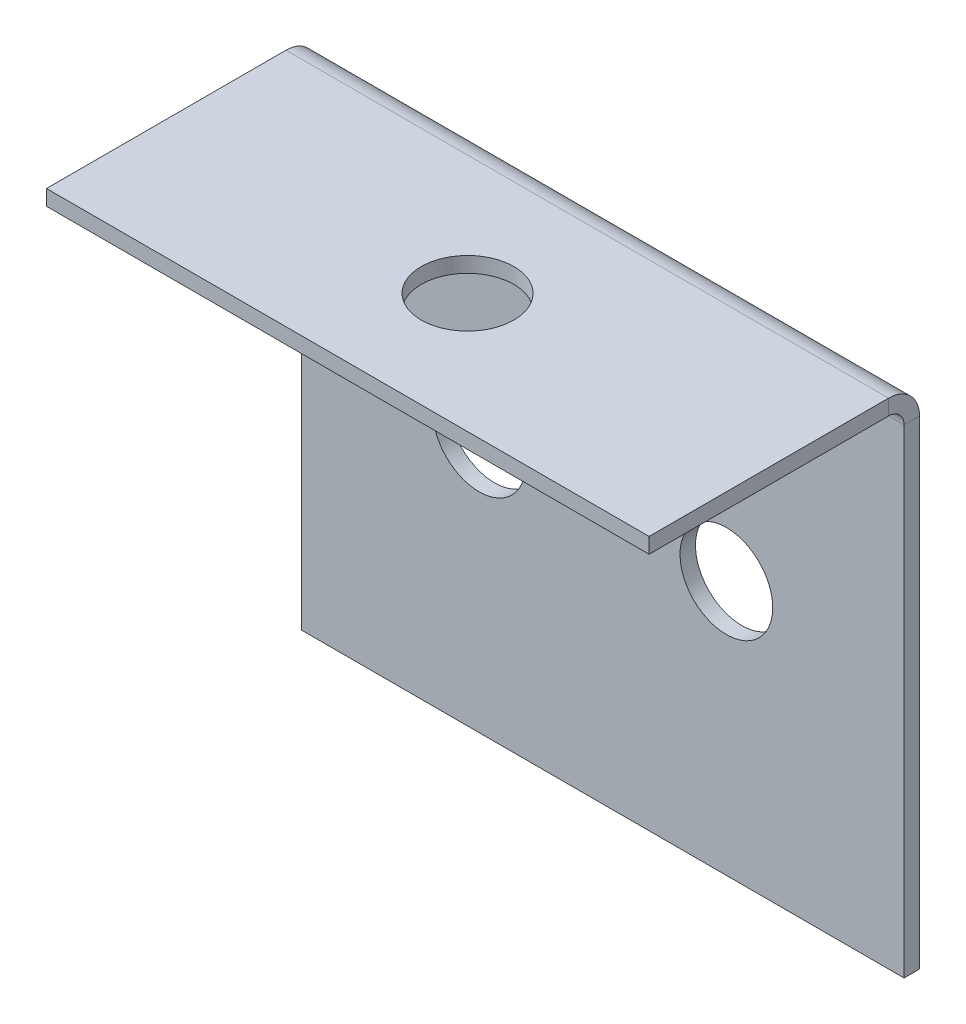
ISO-10303-21;
HEADER;
FILE_DESCRIPTION(('STEP AP214'),'2;1');
FILE_NAME('part.step','',(''),(''),'','','');
FILE_SCHEMA(('AUTOMOTIVE_DESIGN { 1 0 10303 214 1 1 1 1 }'));
ENDSEC;
DATA;
#1=APPLICATION_CONTEXT('core data for automotive mechanical design processes');
#2=APPLICATION_PROTOCOL_DEFINITION('international standard','automotive_design',2000,#1);
#3=PRODUCT_CONTEXT('',#1,'mechanical');
#4=PRODUCT('Part','Part','',(#3));
#5=PRODUCT_RELATED_PRODUCT_CATEGORY('part','',(#4));
#6=PRODUCT_DEFINITION_FORMATION('','',#4);
#7=PRODUCT_DEFINITION_CONTEXT('part definition',#1,'design');
#8=PRODUCT_DEFINITION('design','',#6,#7);
#9=PRODUCT_DEFINITION_SHAPE('','',#8);
#10=(LENGTH_UNIT() NAMED_UNIT(*) SI_UNIT(.MILLI.,.METRE.));
#11=(NAMED_UNIT(*) PLANE_ANGLE_UNIT() SI_UNIT($,.RADIAN.));
#12=(NAMED_UNIT(*) SI_UNIT($,.STERADIAN.) SOLID_ANGLE_UNIT());
#13=UNCERTAINTY_MEASURE_WITH_UNIT(LENGTH_MEASURE(1.E-05),#10,'distance_accuracy_value','');
#14=(GEOMETRIC_REPRESENTATION_CONTEXT(3) GLOBAL_UNCERTAINTY_ASSIGNED_CONTEXT((#13)) GLOBAL_UNIT_ASSIGNED_CONTEXT((#10,
#11,#12)) REPRESENTATION_CONTEXT('',''));
#15=CARTESIAN_POINT('',(0.,0.,0.));
#16=DIRECTION('',(0.,0.,1.));
#17=DIRECTION('',(1.,0.,0.));
#18=AXIS2_PLACEMENT_3D('',#15,#16,#17);
#19=CARTESIAN_POINT('',(19.5,24.9508798646362,0.));
#20=DIRECTION('',(0.,0.,-1.));
#21=DIRECTION('',(0.,1.,0.));
#22=AXIS2_PLACEMENT_3D('',#19,#20,#21);
#23=PLANE('',#22);
#24=DIRECTION('',(0.,-1.,0.));
#25=VECTOR('',#24,1.);
#26=CARTESIAN_POINT('',(0.,24.9508798646362,0.));
#27=LINE('',#26,#25);
#28=CARTESIAN_POINT('',(0.,24.4508798646362,0.));
#29=VERTEX_POINT('',#28);
#30=CARTESIAN_POINT('',(0.,8.95087986463622,0.));
#31=VERTEX_POINT('',#30);
#32=EDGE_CURVE('E150',#29,#31,#27,.T.);
#33=ORIENTED_EDGE('',*,*,#32,.T.);
#34=DIRECTION('',(-1.,0.,0.));
#35=VECTOR('',#34,1.);
#36=CARTESIAN_POINT('',(19.5,8.95087986463622,0.));
#37=LINE('',#36,#35);
#38=CARTESIAN_POINT('',(19.5,8.95087986463622,0.));
#39=VERTEX_POINT('',#38);
#40=EDGE_CURVE('E181',#39,#31,#37,.T.);
#41=ORIENTED_EDGE('',*,*,#40,.F.);
#42=DIRECTION('',(0.,-1.,0.));
#43=VECTOR('',#42,1.);
#44=CARTESIAN_POINT('',(19.5,24.9508798646362,0.));
#45=LINE('',#44,#43);
#46=CARTESIAN_POINT('',(19.5,24.4508798646362,0.));
#47=VERTEX_POINT('',#46);
#48=EDGE_CURVE('E104',#47,#39,#45,.T.);
#49=ORIENTED_EDGE('',*,*,#48,.F.);
#50=DIRECTION('',(-1.,0.,0.));
#51=VECTOR('',#50,1.);
#52=CARTESIAN_POINT('',(19.5,24.4508798646362,0.));
#53=LINE('',#52,#51);
#54=EDGE_CURVE('E149',#47,#29,#53,.T.);
#55=ORIENTED_EDGE('',*,*,#54,.T.);
#56=EDGE_LOOP('',(#33,#41,#49,#55));
#57=FACE_BOUND('',#56,.T.);
#58=CARTESIAN_POINT('',(13.75,17.2008798646362,0.));
#59=DIRECTION('',(0.,0.,-1.));
#60=DIRECTION('',(0.,1.,0.));
#61=AXIS2_PLACEMENT_3D('',#58,#59,#60);
#62=CIRCLE('',#61,1.5);
#63=CARTESIAN_POINT('',(13.75,18.7008798646362,0.));
#64=VERTEX_POINT('',#63);
#65=EDGE_CURVE('E154',#64,#64,#62,.T.);
#66=ORIENTED_EDGE('',*,*,#65,.T.);
#67=EDGE_LOOP('',(#66));
#68=FACE_BOUND('',#67,.T.);
#69=CARTESIAN_POINT('',(5.75,17.2008798646362,0.));
#70=DIRECTION('',(0.,0.,-1.));
#71=DIRECTION('',(0.,1.,0.));
#72=AXIS2_PLACEMENT_3D('',#69,#70,#71);
#73=CIRCLE('',#72,1.5);
#74=CARTESIAN_POINT('',(5.75,18.7008798646362,0.));
#75=VERTEX_POINT('',#74);
#76=EDGE_CURVE('E215',#75,#75,#73,.F.);
#77=ORIENTED_EDGE('',*,*,#76,.F.);
#78=EDGE_LOOP('',(#77));
#79=FACE_BOUND('',#78,.T.);
#80=ADVANCED_FACE('F46',(#57,#68,#79),#23,.F.);
#81=CARTESIAN_POINT('',(19.5,24.9508798646362,-0.5));
#82=DIRECTION('',(0.,0.,-1.));
#83=DIRECTION('',(0.,1.,0.));
#84=AXIS2_PLACEMENT_3D('',#81,#82,#83);
#85=PLANE('',#84);
#86=DIRECTION('',(0.,-1.,0.));
#87=VECTOR('',#86,1.);
#88=CARTESIAN_POINT('',(0.,24.9508798646362,-0.5));
#89=LINE('',#88,#87);
#90=CARTESIAN_POINT('',(0.,24.4508798646362,-0.5));
#91=VERTEX_POINT('',#90);
#92=CARTESIAN_POINT('',(0.,8.95087986463622,-0.500000000000002));
#93=VERTEX_POINT('',#92);
#94=EDGE_CURVE('E157',#91,#93,#89,.T.);
#95=ORIENTED_EDGE('',*,*,#94,.F.);
#96=DIRECTION('',(-1.,0.,0.));
#97=VECTOR('',#96,1.);
#98=CARTESIAN_POINT('',(19.5,24.4508798646362,-0.5));
#99=LINE('',#98,#97);
#100=CARTESIAN_POINT('',(19.5,24.4508798646362,-0.5));
#101=VERTEX_POINT('',#100);
#102=EDGE_CURVE('E176',#101,#91,#99,.T.);
#103=ORIENTED_EDGE('',*,*,#102,.F.);
#104=DIRECTION('',(0.,-1.,0.));
#105=VECTOR('',#104,1.);
#106=CARTESIAN_POINT('',(19.5,24.9508798646362,-0.5));
#107=LINE('',#106,#105);
#108=CARTESIAN_POINT('',(19.5,8.95087986463622,-0.500000000000002));
#109=VERTEX_POINT('',#108);
#110=EDGE_CURVE('E205',#101,#109,#107,.T.);
#111=ORIENTED_EDGE('',*,*,#110,.T.);
#112=DIRECTION('',(-1.,0.,0.));
#113=VECTOR('',#112,1.);
#114=CARTESIAN_POINT('',(19.5,8.95087986463622,-0.500000000000002));
#115=LINE('',#114,#113);
#116=EDGE_CURVE('E179',#109,#93,#115,.T.);
#117=ORIENTED_EDGE('',*,*,#116,.T.);
#118=EDGE_LOOP('',(#95,#103,#111,#117));
#119=FACE_BOUND('',#118,.T.);
#120=CARTESIAN_POINT('',(13.75,17.2008798646362,-0.500000000000001));
#121=DIRECTION('',(0.,0.,-1.));
#122=DIRECTION('',(0.,1.,0.));
#123=AXIS2_PLACEMENT_3D('',#120,#121,#122);
#124=CIRCLE('',#123,1.5);
#125=CARTESIAN_POINT('',(13.75,18.7008798646362,-0.500000000000001));
#126=VERTEX_POINT('',#125);
#127=EDGE_CURVE('E212',#126,#126,#124,.T.);
#128=ORIENTED_EDGE('',*,*,#127,.F.);
#129=EDGE_LOOP('',(#128));
#130=FACE_BOUND('',#129,.T.);
#131=CARTESIAN_POINT('',(5.75,17.2008798646362,-0.500000000000001));
#132=DIRECTION('',(0.,0.,-1.));
#133=DIRECTION('',(0.,1.,0.));
#134=AXIS2_PLACEMENT_3D('',#131,#132,#133);
#135=CIRCLE('',#134,1.5);
#136=CARTESIAN_POINT('',(5.75,18.7008798646362,-0.500000000000001));
#137=VERTEX_POINT('',#136);
#138=EDGE_CURVE('E218',#137,#137,#135,.F.);
#139=ORIENTED_EDGE('',*,*,#138,.T.);
#140=EDGE_LOOP('',(#139));
#141=FACE_BOUND('',#140,.T.);
#142=ADVANCED_FACE('F197',(#119,#130,#141),#85,.T.);
#143=CARTESIAN_POINT('',(19.5,24.9508798646362,0.5));
#144=DIRECTION('',(1.,0.,0.));
#145=DIRECTION('',(0.,0.,-1.));
#146=AXIS2_PLACEMENT_3D('',#143,#144,#145);
#147=PLANE('',#146);
#148=DIRECTION('',(0.,1.,0.));
#149=VECTOR('',#148,1.);
#150=CARTESIAN_POINT('',(19.5,24.9508798646362,0.5));
#151=LINE('',#150,#149);
#152=CARTESIAN_POINT('',(19.5,24.9508798646362,0.5));
#153=VERTEX_POINT('',#152);
#154=CARTESIAN_POINT('',(19.5,25.4508798646362,0.499999999999999));
#155=VERTEX_POINT('',#154);
#156=EDGE_CURVE('E13',#153,#155,#151,.T.);
#157=ORIENTED_EDGE('',*,*,#156,.F.);
#158=CARTESIAN_POINT('',(19.5,24.4508798646362,0.5));
#159=DIRECTION('',(1.,0.,0.));
#160=DIRECTION('',(0.,0.,-1.));
#161=AXIS2_PLACEMENT_3D('',#158,#159,#160);
#162=CIRCLE('',#161,0.5);
#163=EDGE_CURVE('E137',#153,#47,#162,.F.);
#164=ORIENTED_EDGE('',*,*,#163,.T.);
#165=DIRECTION('',(0.,0.,1.));
#166=VECTOR('',#165,1.);
#167=CARTESIAN_POINT('',(19.5,24.4508798646362,-0.5));
#168=LINE('',#167,#166);
#169=EDGE_CURVE('E55',#101,#47,#168,.T.);
#170=ORIENTED_EDGE('',*,*,#169,.F.);
#171=CARTESIAN_POINT('',(19.5,24.4508798646362,0.5));
#172=DIRECTION('',(1.,0.,0.));
#173=DIRECTION('',(0.,0.,-1.));
#174=AXIS2_PLACEMENT_3D('',#171,#172,#173);
#175=CIRCLE('',#174,1.);
#176=EDGE_CURVE('E144',#155,#101,#175,.F.);
#177=ORIENTED_EDGE('',*,*,#176,.F.);
#178=EDGE_LOOP('',(#157,#164,#170,#177));
#179=FACE_BOUND('',#178,.T.);
#180=ADVANCED_FACE('F48',(#179),#147,.T.);
#181=CARTESIAN_POINT('',(19.5,24.4508798646362,-0.5));
#182=DIRECTION('',(1.,0.,0.));
#183=DIRECTION('',(0.,0.,-1.));
#184=AXIS2_PLACEMENT_3D('',#181,#182,#183);
#185=PLANE('',#184);
#186=DIRECTION('',(0.,0.,-1.));
#187=VECTOR('',#186,1.);
#188=CARTESIAN_POINT('',(19.5,24.9508798646362,8.25));
#189=LINE('',#188,#187);
#190=CARTESIAN_POINT('',(19.5,24.9508798646362,8.25));
#191=VERTEX_POINT('',#190);
#192=EDGE_CURVE('E132',#191,#153,#189,.T.);
#193=ORIENTED_EDGE('',*,*,#192,.T.);
#194=ORIENTED_EDGE('',*,*,#156,.T.);
#195=DIRECTION('',(0.,0.,-1.));
#196=VECTOR('',#195,1.);
#197=CARTESIAN_POINT('',(19.5,25.4508798646362,8.25));
#198=LINE('',#197,#196);
#199=CARTESIAN_POINT('',(19.5,25.4508798646362,8.25));
#200=VERTEX_POINT('',#199);
#201=EDGE_CURVE('E142',#200,#155,#198,.T.);
#202=ORIENTED_EDGE('',*,*,#201,.F.);
#203=DIRECTION('',(0.,1.,0.));
#204=VECTOR('',#203,1.);
#205=CARTESIAN_POINT('',(19.5,24.9508798646362,8.25));
#206=LINE('',#205,#204);
#207=EDGE_CURVE('E123',#191,#200,#206,.T.);
#208=ORIENTED_EDGE('',*,*,#207,.F.);
#209=EDGE_LOOP('',(#193,#194,#202,#208));
#210=FACE_BOUND('',#209,.T.);
#211=ADVANCED_FACE('F140',(#210),#185,.T.);
#212=CARTESIAN_POINT('',(0.,24.4508798646362,0.));
#213=DIRECTION('',(-1.,0.,0.));
#214=DIRECTION('',(0.,0.,1.));
#215=AXIS2_PLACEMENT_3D('',#212,#213,#214);
#216=PLANE('',#215);
#217=DIRECTION('',(0.,0.,-1.));
#218=VECTOR('',#217,1.);
#219=CARTESIAN_POINT('',(0.,24.4508798646362,0.));
#220=LINE('',#219,#218);
#221=EDGE_CURVE('E98',#29,#91,#220,.T.);
#222=ORIENTED_EDGE('',*,*,#221,.F.);
#223=CARTESIAN_POINT('',(0.,24.4508798646362,0.5));
#224=DIRECTION('',(1.,0.,0.));
#225=DIRECTION('',(0.,0.,-1.));
#226=AXIS2_PLACEMENT_3D('',#223,#224,#225);
#227=CIRCLE('',#226,0.5);
#228=CARTESIAN_POINT('',(0.,24.9508798646362,0.5));
#229=VERTEX_POINT('',#228);
#230=EDGE_CURVE('E167',#229,#29,#227,.F.);
#231=ORIENTED_EDGE('',*,*,#230,.F.);
#232=DIRECTION('',(0.,-1.,0.));
#233=VECTOR('',#232,1.);
#234=CARTESIAN_POINT('',(0.,25.4508798646362,0.499999999999999));
#235=LINE('',#234,#233);
#236=CARTESIAN_POINT('',(0.,25.4508798646362,0.499999999999999));
#237=VERTEX_POINT('',#236);
#238=EDGE_CURVE('E91',#237,#229,#235,.T.);
#239=ORIENTED_EDGE('',*,*,#238,.F.);
#240=CARTESIAN_POINT('',(0.,24.4508798646362,0.5));
#241=DIRECTION('',(1.,0.,0.));
#242=DIRECTION('',(0.,0.,-1.));
#243=AXIS2_PLACEMENT_3D('',#240,#241,#242);
#244=CIRCLE('',#243,1.);
#245=EDGE_CURVE('E160',#237,#91,#244,.F.);
#246=ORIENTED_EDGE('',*,*,#245,.T.);
#247=EDGE_LOOP('',(#222,#231,#239,#246));
#248=FACE_BOUND('',#247,.T.);
#249=ADVANCED_FACE('F200',(#248),#216,.T.);
#250=CARTESIAN_POINT('',(0.,25.4508798646362,0.499999999999999));
#251=DIRECTION('',(-1.,0.,0.));
#252=DIRECTION('',(0.,0.,1.));
#253=AXIS2_PLACEMENT_3D('',#250,#251,#252);
#254=PLANE('',#253);
#255=ORIENTED_EDGE('',*,*,#32,.F.);
#256=ORIENTED_EDGE('',*,*,#221,.T.);
#257=ORIENTED_EDGE('',*,*,#94,.T.);
#258=DIRECTION('',(0.,0.,1.));
#259=VECTOR('',#258,1.);
#260=CARTESIAN_POINT('',(0.,8.95087986463622,-0.500000000000002));
#261=LINE('',#260,#259);
#262=EDGE_CURVE('E153',#93,#31,#261,.T.);
#263=ORIENTED_EDGE('',*,*,#262,.T.);
#264=EDGE_LOOP('',(#255,#256,#257,#263));
#265=FACE_BOUND('',#264,.T.);
#266=ADVANCED_FACE('F186',(#265),#254,.T.);
#267=CARTESIAN_POINT('',(19.5,8.95087986463622,-0.500000000000002));
#268=DIRECTION('',(0.,-1.,0.));
#269=DIRECTION('',(0.,0.,-1.));
#270=AXIS2_PLACEMENT_3D('',#267,#268,#269);
#271=PLANE('',#270);
#272=ORIENTED_EDGE('',*,*,#262,.F.);
#273=ORIENTED_EDGE('',*,*,#116,.F.);
#274=DIRECTION('',(0.,0.,1.));
#275=VECTOR('',#274,1.);
#276=CARTESIAN_POINT('',(19.5,8.95087986463622,-0.500000000000002));
#277=LINE('',#276,#275);
#278=EDGE_CURVE('E206',#109,#39,#277,.T.);
#279=ORIENTED_EDGE('',*,*,#278,.T.);
#280=ORIENTED_EDGE('',*,*,#40,.T.);
#281=EDGE_LOOP('',(#272,#273,#279,#280));
#282=FACE_BOUND('',#281,.T.);
#283=ADVANCED_FACE('F245',(#282),#271,.T.);
#284=CARTESIAN_POINT('',(19.5,24.4508798646362,0.5));
#285=DIRECTION('',(-1.,0.,0.));
#286=DIRECTION('',(0.,0.,1.));
#287=AXIS2_PLACEMENT_3D('',#284,#285,#286);
#288=CYLINDRICAL_SURFACE('',#287,1.);
#289=ORIENTED_EDGE('',*,*,#245,.F.);
#290=DIRECTION('',(-1.,0.,0.));
#291=VECTOR('',#290,1.);
#292=CARTESIAN_POINT('',(19.5,25.4508798646362,0.499999999999999));
#293=LINE('',#292,#291);
#294=EDGE_CURVE('E173',#155,#237,#293,.T.);
#295=ORIENTED_EDGE('',*,*,#294,.F.);
#296=ORIENTED_EDGE('',*,*,#176,.T.);
#297=ORIENTED_EDGE('',*,*,#102,.T.);
#298=EDGE_LOOP('',(#289,#295,#296,#297));
#299=FACE_BOUND('',#298,.T.);
#300=ADVANCED_FACE('F192',(#299),#288,.T.);
#301=CARTESIAN_POINT('',(19.5,25.4508798646362,8.25));
#302=DIRECTION('',(0.,1.,0.));
#303=DIRECTION('',(0.,0.,1.));
#304=AXIS2_PLACEMENT_3D('',#301,#302,#303);
#305=PLANE('',#304);
#306=CARTESIAN_POINT('',(9.75,25.4508798646362,4.375));
#307=DIRECTION('',(0.,1.,0.));
#308=DIRECTION('',(0.,0.,1.));
#309=AXIS2_PLACEMENT_3D('',#306,#307,#308);
#310=CIRCLE('',#309,1.5);
#311=CARTESIAN_POINT('',(9.75,25.4508798646362,5.875));
#312=VERTEX_POINT('',#311);
#313=EDGE_CURVE('E224',#312,#312,#310,.T.);
#314=ORIENTED_EDGE('',*,*,#313,.F.);
#315=EDGE_LOOP('',(#314));
#316=FACE_BOUND('',#315,.T.);
#317=DIRECTION('',(0.,0.,-1.));
#318=VECTOR('',#317,1.);
#319=CARTESIAN_POINT('',(0.,25.4508798646362,8.25));
#320=LINE('',#319,#318);
#321=CARTESIAN_POINT('',(0.,25.4508798646362,8.25));
#322=VERTEX_POINT('',#321);
#323=EDGE_CURVE('E162',#322,#237,#320,.T.);
#324=ORIENTED_EDGE('',*,*,#323,.F.);
#325=DIRECTION('',(-1.,0.,0.));
#326=VECTOR('',#325,1.);
#327=CARTESIAN_POINT('',(19.5,25.4508798646362,8.25));
#328=LINE('',#327,#326);
#329=EDGE_CURVE('E127',#200,#322,#328,.T.);
#330=ORIENTED_EDGE('',*,*,#329,.F.);
#331=ORIENTED_EDGE('',*,*,#201,.T.);
#332=ORIENTED_EDGE('',*,*,#294,.T.);
#333=EDGE_LOOP('',(#324,#330,#331,#332));
#334=FACE_BOUND('',#333,.T.);
#335=ADVANCED_FACE('F203',(#316,#334),#305,.T.);
#336=CARTESIAN_POINT('',(19.5,24.9508798646362,8.25));
#337=DIRECTION('',(0.,0.,1.));
#338=DIRECTION('',(1.,0.,0.));
#339=AXIS2_PLACEMENT_3D('',#336,#337,#338);
#340=PLANE('',#339);
#341=DIRECTION('',(0.,1.,0.));
#342=VECTOR('',#341,1.);
#343=CARTESIAN_POINT('',(0.,24.9508798646362,8.25));
#344=LINE('',#343,#342);
#345=CARTESIAN_POINT('',(0.,24.9508798646362,8.25));
#346=VERTEX_POINT('',#345);
#347=EDGE_CURVE('E125',#346,#322,#344,.T.);
#348=ORIENTED_EDGE('',*,*,#347,.F.);
#349=DIRECTION('',(-1.,0.,0.));
#350=VECTOR('',#349,1.);
#351=CARTESIAN_POINT('',(19.5,24.9508798646362,8.25));
#352=LINE('',#351,#350);
#353=EDGE_CURVE('E119',#191,#346,#352,.T.);
#354=ORIENTED_EDGE('',*,*,#353,.F.);
#355=ORIENTED_EDGE('',*,*,#207,.T.);
#356=ORIENTED_EDGE('',*,*,#329,.T.);
#357=EDGE_LOOP('',(#348,#354,#355,#356));
#358=FACE_BOUND('',#357,.T.);
#359=ADVANCED_FACE('F121',(#358),#340,.T.);
#360=CARTESIAN_POINT('',(19.5,24.9508798646362,8.25));
#361=DIRECTION('',(0.,1.,0.));
#362=DIRECTION('',(0.,0.,1.));
#363=AXIS2_PLACEMENT_3D('',#360,#361,#362);
#364=PLANE('',#363);
#365=CARTESIAN_POINT('',(9.75,24.9508798646362,4.375));
#366=DIRECTION('',(0.,1.,0.));
#367=DIRECTION('',(0.,0.,1.));
#368=AXIS2_PLACEMENT_3D('',#365,#366,#367);
#369=CIRCLE('',#368,1.5);
#370=CARTESIAN_POINT('',(9.75,24.9508798646362,5.875));
#371=VERTEX_POINT('',#370);
#372=EDGE_CURVE('E221',#371,#371,#369,.T.);
#373=ORIENTED_EDGE('',*,*,#372,.T.);
#374=EDGE_LOOP('',(#373));
#375=FACE_BOUND('',#374,.T.);
#376=DIRECTION('',(0.,0.,-1.));
#377=VECTOR('',#376,1.);
#378=CARTESIAN_POINT('',(0.,24.9508798646362,8.25));
#379=LINE('',#378,#377);
#380=EDGE_CURVE('E165',#346,#229,#379,.T.);
#381=ORIENTED_EDGE('',*,*,#380,.T.);
#382=DIRECTION('',(-1.,0.,0.));
#383=VECTOR('',#382,1.);
#384=CARTESIAN_POINT('',(19.5,24.9508798646362,0.5));
#385=LINE('',#384,#383);
#386=EDGE_CURVE('E128',#153,#229,#385,.T.);
#387=ORIENTED_EDGE('',*,*,#386,.F.);
#388=ORIENTED_EDGE('',*,*,#192,.F.);
#389=ORIENTED_EDGE('',*,*,#353,.T.);
#390=EDGE_LOOP('',(#381,#387,#388,#389));
#391=FACE_BOUND('',#390,.T.);
#392=ADVANCED_FACE('F133',(#375,#391),#364,.F.);
#393=CARTESIAN_POINT('',(19.5,24.4508798646362,0.5));
#394=DIRECTION('',(-1.,0.,0.));
#395=DIRECTION('',(0.,0.,1.));
#396=AXIS2_PLACEMENT_3D('',#393,#394,#395);
#397=CYLINDRICAL_SURFACE('',#396,0.5);
#398=ORIENTED_EDGE('',*,*,#230,.T.);
#399=ORIENTED_EDGE('',*,*,#54,.F.);
#400=ORIENTED_EDGE('',*,*,#163,.F.);
#401=ORIENTED_EDGE('',*,*,#386,.T.);
#402=EDGE_LOOP('',(#398,#399,#400,#401));
#403=FACE_BOUND('',#402,.T.);
#404=ADVANCED_FACE('F315',(#403),#397,.F.);
#405=CARTESIAN_POINT('',(19.5,24.4508798646362,0.5));
#406=DIRECTION('',(1.,0.,0.));
#407=DIRECTION('',(0.,0.,-1.));
#408=AXIS2_PLACEMENT_3D('',#405,#406,#407);
#409=PLANE('',#408);
#410=ORIENTED_EDGE('',*,*,#48,.T.);
#411=ORIENTED_EDGE('',*,*,#278,.F.);
#412=ORIENTED_EDGE('',*,*,#110,.F.);
#413=ORIENTED_EDGE('',*,*,#169,.T.);
#414=EDGE_LOOP('',(#410,#411,#412,#413));
#415=FACE_BOUND('',#414,.T.);
#416=ADVANCED_FACE('F341',(#415),#409,.T.);
#417=CARTESIAN_POINT('',(0.,24.4508798646362,0.5));
#418=DIRECTION('',(1.,0.,0.));
#419=DIRECTION('',(0.,0.,-1.));
#420=AXIS2_PLACEMENT_3D('',#417,#418,#419);
#421=PLANE('',#420);
#422=ORIENTED_EDGE('',*,*,#323,.T.);
#423=ORIENTED_EDGE('',*,*,#238,.T.);
#424=ORIENTED_EDGE('',*,*,#380,.F.);
#425=ORIENTED_EDGE('',*,*,#347,.T.);
#426=EDGE_LOOP('',(#422,#423,#424,#425));
#427=FACE_BOUND('',#426,.T.);
#428=ADVANCED_FACE('F284',(#427),#421,.F.);
#429=CARTESIAN_POINT('',(13.75,17.2008798646362,0.));
#430=DIRECTION('',(0.,0.,-1.));
#431=DIRECTION('',(0.,1.,0.));
#432=AXIS2_PLACEMENT_3D('',#429,#430,#431);
#433=CYLINDRICAL_SURFACE('',#432,1.5);
#434=ORIENTED_EDGE('',*,*,#65,.F.);
#435=EDGE_LOOP('',(#434));
#436=FACE_BOUND('',#435,.T.);
#437=ORIENTED_EDGE('',*,*,#127,.T.);
#438=EDGE_LOOP('',(#437));
#439=FACE_BOUND('',#438,.T.);
#440=ADVANCED_FACE('F279',(#436,#439),#433,.F.);
#441=CARTESIAN_POINT('',(5.75,17.2008798646362,0.));
#442=DIRECTION('',(0.,0.,-1.));
#443=DIRECTION('',(0.,1.,0.));
#444=AXIS2_PLACEMENT_3D('',#441,#442,#443);
#445=CYLINDRICAL_SURFACE('',#444,1.5);
#446=ORIENTED_EDGE('',*,*,#76,.T.);
#447=EDGE_LOOP('',(#446));
#448=FACE_BOUND('',#447,.T.);
#449=ORIENTED_EDGE('',*,*,#138,.F.);
#450=EDGE_LOOP('',(#449));
#451=FACE_BOUND('',#450,.T.);
#452=ADVANCED_FACE('F234',(#448,#451),#445,.F.);
#453=CARTESIAN_POINT('',(9.75,24.9508798646362,4.375));
#454=DIRECTION('',(0.,1.,0.));
#455=DIRECTION('',(0.,0.,1.));
#456=AXIS2_PLACEMENT_3D('',#453,#454,#455);
#457=CYLINDRICAL_SURFACE('',#456,1.5);
#458=ORIENTED_EDGE('',*,*,#372,.F.);
#459=EDGE_LOOP('',(#458));
#460=FACE_BOUND('',#459,.T.);
#461=ORIENTED_EDGE('',*,*,#313,.T.);
#462=EDGE_LOOP('',(#461));
#463=FACE_BOUND('',#462,.T.);
#464=ADVANCED_FACE('F231',(#460,#463),#457,.F.);
#465=CLOSED_SHELL('',(#80,#142,#180,#211,#249,#266,#283,#300,#335,#359,#392,#404,#416,#428,#440,
#452,#464));
#466=MANIFOLD_SOLID_BREP('B2',#465);
#467=ADVANCED_BREP_SHAPE_REPRESENTATION('',(#18,#466),#14);
#468=SHAPE_DEFINITION_REPRESENTATION(#9,#467);
ENDSEC;
END-ISO-10303-21;
